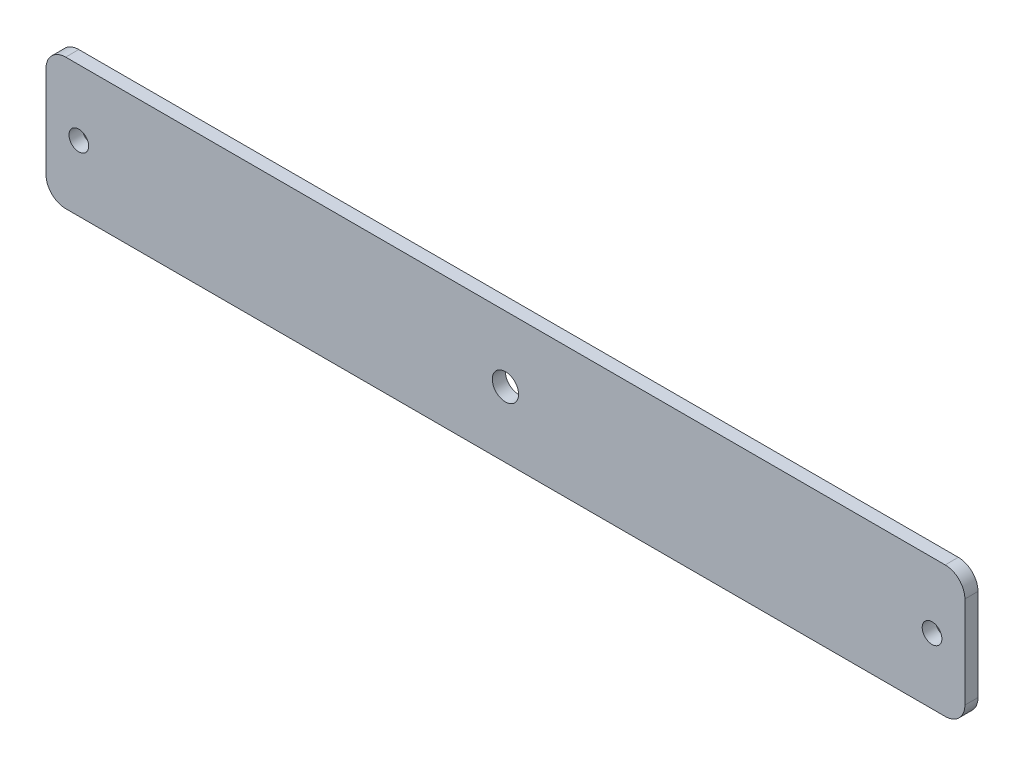
ISO-10303-21;
HEADER;
FILE_DESCRIPTION(('STEP AP214'),'2;1');
FILE_NAME('part.step','',(''),(''),'','','');
FILE_SCHEMA(('AUTOMOTIVE_DESIGN { 1 0 10303 214 1 1 1 1 }'));
ENDSEC;
DATA;
#1=APPLICATION_CONTEXT('core data for automotive mechanical design processes');
#2=APPLICATION_PROTOCOL_DEFINITION('international standard','automotive_design',2000,#1);
#3=PRODUCT_CONTEXT('',#1,'mechanical');
#4=PRODUCT('Part','Part','',(#3));
#5=PRODUCT_RELATED_PRODUCT_CATEGORY('part','',(#4));
#6=PRODUCT_DEFINITION_FORMATION('','',#4);
#7=PRODUCT_DEFINITION_CONTEXT('part definition',#1,'design');
#8=PRODUCT_DEFINITION('design','',#6,#7);
#9=PRODUCT_DEFINITION_SHAPE('','',#8);
#10=(LENGTH_UNIT() NAMED_UNIT(*) SI_UNIT(.MILLI.,.METRE.));
#11=(NAMED_UNIT(*) PLANE_ANGLE_UNIT() SI_UNIT($,.RADIAN.));
#12=(NAMED_UNIT(*) SI_UNIT($,.STERADIAN.) SOLID_ANGLE_UNIT());
#13=UNCERTAINTY_MEASURE_WITH_UNIT(LENGTH_MEASURE(1.E-05),#10,'distance_accuracy_value','');
#14=(GEOMETRIC_REPRESENTATION_CONTEXT(3) GLOBAL_UNCERTAINTY_ASSIGNED_CONTEXT((#13)) GLOBAL_UNIT_ASSIGNED_CONTEXT((#10,
#11,#12)) REPRESENTATION_CONTEXT('',''));
#15=CARTESIAN_POINT('',(0.,0.,0.));
#16=DIRECTION('',(0.,0.,1.));
#17=DIRECTION('',(1.,0.,0.));
#18=AXIS2_PLACEMENT_3D('',#15,#16,#17);
#19=CARTESIAN_POINT('',(0.,0.,2.));
#20=DIRECTION('',(0.,0.,-1.));
#21=DIRECTION('',(-1.,0.,0.));
#22=AXIS2_PLACEMENT_3D('',#19,#20,#21);
#23=PLANE('',#22);
#24=DIRECTION('',(0.,1.,0.));
#25=VECTOR('',#24,1.);
#26=CARTESIAN_POINT('',(73.9464380551708,20.,2.));
#27=LINE('',#26,#25);
#28=CARTESIAN_POINT('',(73.9464380551708,3.,2.));
#29=VERTEX_POINT('',#28);
#30=CARTESIAN_POINT('',(73.9464380551708,17.,2.));
#31=VERTEX_POINT('',#30);
#32=EDGE_CURVE('E204',#29,#31,#27,.T.);
#33=ORIENTED_EDGE('',*,*,#32,.T.);
#34=CARTESIAN_POINT('',(70.9464380551708,17.,2.));
#35=DIRECTION('',(0.,0.,-1.));
#36=DIRECTION('',(-1.,0.,0.));
#37=AXIS2_PLACEMENT_3D('',#34,#35,#36);
#38=CIRCLE('',#37,3.);
#39=CARTESIAN_POINT('',(70.9464380551708,20.,2.));
#40=VERTEX_POINT('',#39);
#41=EDGE_CURVE('E178',#31,#40,#38,.F.);
#42=ORIENTED_EDGE('',*,*,#41,.T.);
#43=DIRECTION('',(-1.,0.,0.));
#44=VECTOR('',#43,1.);
#45=CARTESIAN_POINT('',(-66.0535619448292,20.,2.));
#46=LINE('',#45,#44);
#47=CARTESIAN_POINT('',(-63.0535619448292,20.,2.));
#48=VERTEX_POINT('',#47);
#49=EDGE_CURVE('E131',#40,#48,#46,.T.);
#50=ORIENTED_EDGE('',*,*,#49,.T.);
#51=CARTESIAN_POINT('',(-63.0535619448292,17.,2.));
#52=DIRECTION('',(0.,0.,-1.));
#53=DIRECTION('',(-1.,0.,0.));
#54=AXIS2_PLACEMENT_3D('',#51,#52,#53);
#55=CIRCLE('',#54,3.);
#56=CARTESIAN_POINT('',(-66.0535619448292,17.,2.));
#57=VERTEX_POINT('',#56);
#58=EDGE_CURVE('E66',#48,#57,#55,.F.);
#59=ORIENTED_EDGE('',*,*,#58,.T.);
#60=DIRECTION('',(0.,-1.,0.));
#61=VECTOR('',#60,1.);
#62=CARTESIAN_POINT('',(-66.0535619448292,0.,2.));
#63=LINE('',#62,#61);
#64=CARTESIAN_POINT('',(-66.0535619448292,3.,2.));
#65=VERTEX_POINT('',#64);
#66=EDGE_CURVE('E156',#57,#65,#63,.T.);
#67=ORIENTED_EDGE('',*,*,#66,.T.);
#68=CARTESIAN_POINT('',(-63.0535619448292,3.,2.));
#69=DIRECTION('',(0.,0.,-1.));
#70=DIRECTION('',(-1.,0.,0.));
#71=AXIS2_PLACEMENT_3D('',#68,#69,#70);
#72=CIRCLE('',#71,3.);
#73=CARTESIAN_POINT('',(-63.0535619448292,0.,2.));
#74=VERTEX_POINT('',#73);
#75=EDGE_CURVE('E172',#65,#74,#72,.F.);
#76=ORIENTED_EDGE('',*,*,#75,.T.);
#77=DIRECTION('',(1.,0.,0.));
#78=VECTOR('',#77,1.);
#79=CARTESIAN_POINT('',(73.9464380551708,0.,2.));
#80=LINE('',#79,#78);
#81=CARTESIAN_POINT('',(70.9464380551708,0.,2.));
#82=VERTEX_POINT('',#81);
#83=EDGE_CURVE('E154',#74,#82,#80,.T.);
#84=ORIENTED_EDGE('',*,*,#83,.T.);
#85=CARTESIAN_POINT('',(70.9464380551708,3.,2.));
#86=DIRECTION('',(0.,0.,-1.));
#87=DIRECTION('',(-1.,0.,0.));
#88=AXIS2_PLACEMENT_3D('',#85,#86,#87);
#89=CIRCLE('',#88,3.);
#90=EDGE_CURVE('E175',#82,#29,#89,.F.);
#91=ORIENTED_EDGE('',*,*,#90,.T.);
#92=EDGE_LOOP('',(#33,#42,#50,#59,#67,#76,#84,#91));
#93=FACE_BOUND('',#92,.T.);
#94=CARTESIAN_POINT('',(3.94643805517084,9.99999999999999,2.));
#95=DIRECTION('',(0.,0.,1.));
#96=DIRECTION('',(1.,0.,0.));
#97=AXIS2_PLACEMENT_3D('',#94,#95,#96);
#98=CIRCLE('',#97,2.);
#99=CARTESIAN_POINT('',(5.94643805517084,9.99999999999999,2.));
#100=VERTEX_POINT('',#99);
#101=EDGE_CURVE('E147',#100,#100,#98,.T.);
#102=ORIENTED_EDGE('',*,*,#101,.F.);
#103=EDGE_LOOP('',(#102));
#104=FACE_BOUND('',#103,.T.);
#105=CARTESIAN_POINT('',(-61.0535619448292,9.99999999999999,2.));
#106=DIRECTION('',(0.,0.,1.));
#107=DIRECTION('',(1.,0.,0.));
#108=AXIS2_PLACEMENT_3D('',#105,#106,#107);
#109=CIRCLE('',#108,1.5);
#110=CARTESIAN_POINT('',(-59.5535619448292,9.99999999999999,2.));
#111=VERTEX_POINT('',#110);
#112=EDGE_CURVE('E225',#111,#111,#109,.T.);
#113=ORIENTED_EDGE('',*,*,#112,.F.);
#114=EDGE_LOOP('',(#113));
#115=FACE_BOUND('',#114,.T.);
#116=CARTESIAN_POINT('',(68.9464380551708,9.99999999999999,2.));
#117=DIRECTION('',(0.,0.,1.));
#118=DIRECTION('',(1.,0.,0.));
#119=AXIS2_PLACEMENT_3D('',#116,#117,#118);
#120=CIRCLE('',#119,1.5);
#121=CARTESIAN_POINT('',(70.4464380551708,9.99999999999999,2.));
#122=VERTEX_POINT('',#121);
#123=EDGE_CURVE('E228',#122,#122,#120,.T.);
#124=ORIENTED_EDGE('',*,*,#123,.F.);
#125=EDGE_LOOP('',(#124));
#126=FACE_BOUND('',#125,.T.);
#127=ADVANCED_FACE('F45',(#93,#104,#115,#126),#23,.F.);
#128=CARTESIAN_POINT('',(0.,0.,0.));
#129=DIRECTION('',(0.,0.,-1.));
#130=DIRECTION('',(-1.,0.,0.));
#131=AXIS2_PLACEMENT_3D('',#128,#129,#130);
#132=PLANE('',#131);
#133=CARTESIAN_POINT('',(-61.0535619448292,9.99999999999999,0.));
#134=DIRECTION('',(0.,0.,1.));
#135=DIRECTION('',(1.,0.,0.));
#136=AXIS2_PLACEMENT_3D('',#133,#134,#135);
#137=CIRCLE('',#136,1.5);
#138=CARTESIAN_POINT('',(-59.5535619448292,9.99999999999999,0.));
#139=VERTEX_POINT('',#138);
#140=EDGE_CURVE('E231',#139,#139,#137,.T.);
#141=ORIENTED_EDGE('',*,*,#140,.T.);
#142=EDGE_LOOP('',(#141));
#143=FACE_BOUND('',#142,.T.);
#144=DIRECTION('',(-1.,0.,0.));
#145=VECTOR('',#144,1.);
#146=CARTESIAN_POINT('',(-66.0535619448292,20.,0.));
#147=LINE('',#146,#145);
#148=CARTESIAN_POINT('',(70.9464380551708,20.,0.));
#149=VERTEX_POINT('',#148);
#150=CARTESIAN_POINT('',(-63.0535619448292,20.,0.));
#151=VERTEX_POINT('',#150);
#152=EDGE_CURVE('E129',#149,#151,#147,.T.);
#153=ORIENTED_EDGE('',*,*,#152,.F.);
#154=CARTESIAN_POINT('',(70.9464380551708,17.,0.));
#155=DIRECTION('',(0.,0.,-1.));
#156=DIRECTION('',(-1.,0.,0.));
#157=AXIS2_PLACEMENT_3D('',#154,#155,#156);
#158=CIRCLE('',#157,3.);
#159=CARTESIAN_POINT('',(73.9464380551708,17.,0.));
#160=VERTEX_POINT('',#159);
#161=EDGE_CURVE('E111',#149,#160,#158,.T.);
#162=ORIENTED_EDGE('',*,*,#161,.T.);
#163=DIRECTION('',(0.,1.,0.));
#164=VECTOR('',#163,1.);
#165=CARTESIAN_POINT('',(73.9464380551708,20.,0.));
#166=LINE('',#165,#164);
#167=CARTESIAN_POINT('',(73.9464380551708,3.,0.));
#168=VERTEX_POINT('',#167);
#169=EDGE_CURVE('E141',#168,#160,#166,.T.);
#170=ORIENTED_EDGE('',*,*,#169,.F.);
#171=CARTESIAN_POINT('',(70.9464380551708,3.,0.));
#172=DIRECTION('',(0.,0.,-1.));
#173=DIRECTION('',(-1.,0.,0.));
#174=AXIS2_PLACEMENT_3D('',#171,#172,#173);
#175=CIRCLE('',#174,3.);
#176=CARTESIAN_POINT('',(70.9464380551708,0.,0.));
#177=VERTEX_POINT('',#176);
#178=EDGE_CURVE('E123',#168,#177,#175,.T.);
#179=ORIENTED_EDGE('',*,*,#178,.T.);
#180=DIRECTION('',(1.,0.,0.));
#181=VECTOR('',#180,1.);
#182=CARTESIAN_POINT('',(0.,0.,0.));
#183=LINE('',#182,#181);
#184=CARTESIAN_POINT('',(-63.0535619448292,0.,0.));
#185=VERTEX_POINT('',#184);
#186=EDGE_CURVE('E145',#185,#177,#183,.T.);
#187=ORIENTED_EDGE('',*,*,#186,.F.);
#188=CARTESIAN_POINT('',(-63.0535619448292,3.,0.));
#189=DIRECTION('',(0.,0.,-1.));
#190=DIRECTION('',(-1.,0.,0.));
#191=AXIS2_PLACEMENT_3D('',#188,#189,#190);
#192=CIRCLE('',#191,3.);
#193=CARTESIAN_POINT('',(-66.0535619448292,3.,0.));
#194=VERTEX_POINT('',#193);
#195=EDGE_CURVE('E160',#185,#194,#192,.T.);
#196=ORIENTED_EDGE('',*,*,#195,.T.);
#197=DIRECTION('',(0.,-1.,0.));
#198=VECTOR('',#197,1.);
#199=CARTESIAN_POINT('',(-66.0535619448292,0.,0.));
#200=LINE('',#199,#198);
#201=CARTESIAN_POINT('',(-66.0535619448292,17.,0.));
#202=VERTEX_POINT('',#201);
#203=EDGE_CURVE('E140',#202,#194,#200,.T.);
#204=ORIENTED_EDGE('',*,*,#203,.F.);
#205=CARTESIAN_POINT('',(-63.0535619448292,17.,0.));
#206=DIRECTION('',(0.,0.,-1.));
#207=DIRECTION('',(-1.,0.,0.));
#208=AXIS2_PLACEMENT_3D('',#205,#206,#207);
#209=CIRCLE('',#208,3.);
#210=EDGE_CURVE('E133',#202,#151,#209,.T.);
#211=ORIENTED_EDGE('',*,*,#210,.T.);
#212=EDGE_LOOP('',(#153,#162,#170,#179,#187,#196,#204,#211));
#213=FACE_BOUND('',#212,.T.);
#214=CARTESIAN_POINT('',(3.94643805517084,9.99999999999999,0.));
#215=DIRECTION('',(0.,0.,1.));
#216=DIRECTION('',(1.,0.,0.));
#217=AXIS2_PLACEMENT_3D('',#214,#215,#216);
#218=CIRCLE('',#217,2.);
#219=CARTESIAN_POINT('',(5.94643805517084,9.99999999999999,0.));
#220=VERTEX_POINT('',#219);
#221=EDGE_CURVE('E210',#220,#220,#218,.T.);
#222=ORIENTED_EDGE('',*,*,#221,.T.);
#223=EDGE_LOOP('',(#222));
#224=FACE_BOUND('',#223,.T.);
#225=CARTESIAN_POINT('',(68.9464380551708,9.99999999999999,0.));
#226=DIRECTION('',(0.,0.,1.));
#227=DIRECTION('',(1.,0.,0.));
#228=AXIS2_PLACEMENT_3D('',#225,#226,#227);
#229=CIRCLE('',#228,1.5);
#230=CARTESIAN_POINT('',(70.4464380551708,9.99999999999999,0.));
#231=VERTEX_POINT('',#230);
#232=EDGE_CURVE('E232',#231,#231,#229,.T.);
#233=ORIENTED_EDGE('',*,*,#232,.T.);
#234=EDGE_LOOP('',(#233));
#235=FACE_BOUND('',#234,.T.);
#236=ADVANCED_FACE('F136',(#143,#213,#224,#235),#132,.T.);
#237=CARTESIAN_POINT('',(73.9464380551708,20.,2.));
#238=DIRECTION('',(-1.,0.,0.));
#239=DIRECTION('',(0.,0.,1.));
#240=AXIS2_PLACEMENT_3D('',#237,#238,#239);
#241=PLANE('',#240);
#242=ORIENTED_EDGE('',*,*,#169,.T.);
#243=DIRECTION('',(0.,0.,-1.));
#244=VECTOR('',#243,1.);
#245=CARTESIAN_POINT('',(73.9464380551708,17.,2.));
#246=LINE('',#245,#244);
#247=EDGE_CURVE('E116',#160,#31,#246,.F.);
#248=ORIENTED_EDGE('',*,*,#247,.T.);
#249=ORIENTED_EDGE('',*,*,#32,.F.);
#250=DIRECTION('',(0.,0.,-1.));
#251=VECTOR('',#250,1.);
#252=CARTESIAN_POINT('',(73.9464380551708,3.,2.));
#253=LINE('',#252,#251);
#254=EDGE_CURVE('E122',#29,#168,#253,.T.);
#255=ORIENTED_EDGE('',*,*,#254,.T.);
#256=EDGE_LOOP('',(#242,#248,#249,#255));
#257=FACE_BOUND('',#256,.T.);
#258=ADVANCED_FACE('F264',(#257),#241,.F.);
#259=CARTESIAN_POINT('',(-66.0535619448292,20.,2.));
#260=DIRECTION('',(0.,-1.,0.));
#261=DIRECTION('',(0.,0.,-1.));
#262=AXIS2_PLACEMENT_3D('',#259,#260,#261);
#263=PLANE('',#262);
#264=ORIENTED_EDGE('',*,*,#49,.F.);
#265=DIRECTION('',(0.,0.,-1.));
#266=VECTOR('',#265,1.);
#267=CARTESIAN_POINT('',(70.9464380551708,20.,2.));
#268=LINE('',#267,#266);
#269=EDGE_CURVE('E115',#40,#149,#268,.T.);
#270=ORIENTED_EDGE('',*,*,#269,.T.);
#271=ORIENTED_EDGE('',*,*,#152,.T.);
#272=DIRECTION('',(0.,0.,-1.));
#273=VECTOR('',#272,1.);
#274=CARTESIAN_POINT('',(-63.0535619448292,20.,2.));
#275=LINE('',#274,#273);
#276=EDGE_CURVE('E134',#151,#48,#275,.F.);
#277=ORIENTED_EDGE('',*,*,#276,.T.);
#278=EDGE_LOOP('',(#264,#270,#271,#277));
#279=FACE_BOUND('',#278,.T.);
#280=ADVANCED_FACE('F128',(#279),#263,.F.);
#281=CARTESIAN_POINT('',(-66.0535619448292,0.,2.));
#282=DIRECTION('',(1.,0.,0.));
#283=DIRECTION('',(0.,0.,-1.));
#284=AXIS2_PLACEMENT_3D('',#281,#282,#283);
#285=PLANE('',#284);
#286=ORIENTED_EDGE('',*,*,#203,.T.);
#287=DIRECTION('',(0.,0.,-1.));
#288=VECTOR('',#287,1.);
#289=CARTESIAN_POINT('',(-66.0535619448292,3.,2.));
#290=LINE('',#289,#288);
#291=EDGE_CURVE('E11',#194,#65,#290,.F.);
#292=ORIENTED_EDGE('',*,*,#291,.T.);
#293=ORIENTED_EDGE('',*,*,#66,.F.);
#294=DIRECTION('',(0.,0.,-1.));
#295=VECTOR('',#294,1.);
#296=CARTESIAN_POINT('',(-66.0535619448292,17.,2.));
#297=LINE('',#296,#295);
#298=EDGE_CURVE('E54',#57,#202,#297,.T.);
#299=ORIENTED_EDGE('',*,*,#298,.T.);
#300=EDGE_LOOP('',(#286,#292,#293,#299));
#301=FACE_BOUND('',#300,.T.);
#302=ADVANCED_FACE('F190',(#301),#285,.F.);
#303=CARTESIAN_POINT('',(0.,0.,2.));
#304=DIRECTION('',(0.,1.,0.));
#305=DIRECTION('',(0.,0.,1.));
#306=AXIS2_PLACEMENT_3D('',#303,#304,#305);
#307=PLANE('',#306);
#308=ORIENTED_EDGE('',*,*,#186,.T.);
#309=DIRECTION('',(0.,0.,-1.));
#310=VECTOR('',#309,1.);
#311=CARTESIAN_POINT('',(70.9464380551708,0.,2.));
#312=LINE('',#311,#310);
#313=EDGE_CURVE('E185',#177,#82,#312,.F.);
#314=ORIENTED_EDGE('',*,*,#313,.T.);
#315=ORIENTED_EDGE('',*,*,#83,.F.);
#316=DIRECTION('',(0.,0.,-1.));
#317=VECTOR('',#316,1.);
#318=CARTESIAN_POINT('',(-63.0535619448292,0.,2.));
#319=LINE('',#318,#317);
#320=EDGE_CURVE('E181',#74,#185,#319,.T.);
#321=ORIENTED_EDGE('',*,*,#320,.T.);
#322=EDGE_LOOP('',(#308,#314,#315,#321));
#323=FACE_BOUND('',#322,.T.);
#324=ADVANCED_FACE('F199',(#323),#307,.F.);
#325=CARTESIAN_POINT('',(3.94643805517084,9.99999999999999,2.));
#326=DIRECTION('',(0.,0.,-1.));
#327=DIRECTION('',(-1.,0.,0.));
#328=AXIS2_PLACEMENT_3D('',#325,#326,#327);
#329=CYLINDRICAL_SURFACE('',#328,2.);
#330=ORIENTED_EDGE('',*,*,#101,.T.);
#331=EDGE_LOOP('',(#330));
#332=FACE_BOUND('',#331,.T.);
#333=ORIENTED_EDGE('',*,*,#221,.F.);
#334=EDGE_LOOP('',(#333));
#335=FACE_BOUND('',#334,.T.);
#336=ADVANCED_FACE('F249',(#332,#335),#329,.F.);
#337=CARTESIAN_POINT('',(-61.0535619448292,9.99999999999999,2.));
#338=DIRECTION('',(0.,0.,-1.));
#339=DIRECTION('',(-1.,0.,0.));
#340=AXIS2_PLACEMENT_3D('',#337,#338,#339);
#341=CYLINDRICAL_SURFACE('',#340,1.5);
#342=ORIENTED_EDGE('',*,*,#112,.T.);
#343=EDGE_LOOP('',(#342));
#344=FACE_BOUND('',#343,.T.);
#345=ORIENTED_EDGE('',*,*,#140,.F.);
#346=EDGE_LOOP('',(#345));
#347=FACE_BOUND('',#346,.T.);
#348=ADVANCED_FACE('F251',(#344,#347),#341,.F.);
#349=CARTESIAN_POINT('',(68.9464380551708,9.99999999999999,2.));
#350=DIRECTION('',(0.,0.,-1.));
#351=DIRECTION('',(-1.,0.,0.));
#352=AXIS2_PLACEMENT_3D('',#349,#350,#351);
#353=CYLINDRICAL_SURFACE('',#352,1.5);
#354=ORIENTED_EDGE('',*,*,#123,.T.);
#355=EDGE_LOOP('',(#354));
#356=FACE_BOUND('',#355,.T.);
#357=ORIENTED_EDGE('',*,*,#232,.F.);
#358=EDGE_LOOP('',(#357));
#359=FACE_BOUND('',#358,.T.);
#360=ADVANCED_FACE('F256',(#356,#359),#353,.F.);
#361=CARTESIAN_POINT('',(70.9464380551708,17.,2.));
#362=DIRECTION('',(0.,0.,-1.));
#363=DIRECTION('',(-1.,0.,0.));
#364=AXIS2_PLACEMENT_3D('',#361,#362,#363);
#365=CYLINDRICAL_SURFACE('',#364,3.);
#366=ORIENTED_EDGE('',*,*,#41,.F.);
#367=ORIENTED_EDGE('',*,*,#247,.F.);
#368=ORIENTED_EDGE('',*,*,#161,.F.);
#369=ORIENTED_EDGE('',*,*,#269,.F.);
#370=EDGE_LOOP('',(#366,#367,#368,#369));
#371=FACE_BOUND('',#370,.T.);
#372=ADVANCED_FACE('F114',(#371),#365,.T.);
#373=CARTESIAN_POINT('',(70.9464380551708,3.,2.));
#374=DIRECTION('',(0.,0.,-1.));
#375=DIRECTION('',(-1.,0.,0.));
#376=AXIS2_PLACEMENT_3D('',#373,#374,#375);
#377=CYLINDRICAL_SURFACE('',#376,3.);
#378=ORIENTED_EDGE('',*,*,#90,.F.);
#379=ORIENTED_EDGE('',*,*,#313,.F.);
#380=ORIENTED_EDGE('',*,*,#178,.F.);
#381=ORIENTED_EDGE('',*,*,#254,.F.);
#382=EDGE_LOOP('',(#378,#379,#380,#381));
#383=FACE_BOUND('',#382,.T.);
#384=ADVANCED_FACE('F276',(#383),#377,.T.);
#385=CARTESIAN_POINT('',(-63.0535619448292,3.,2.));
#386=DIRECTION('',(0.,0.,-1.));
#387=DIRECTION('',(-1.,0.,0.));
#388=AXIS2_PLACEMENT_3D('',#385,#386,#387);
#389=CYLINDRICAL_SURFACE('',#388,3.);
#390=ORIENTED_EDGE('',*,*,#75,.F.);
#391=ORIENTED_EDGE('',*,*,#291,.F.);
#392=ORIENTED_EDGE('',*,*,#195,.F.);
#393=ORIENTED_EDGE('',*,*,#320,.F.);
#394=EDGE_LOOP('',(#390,#391,#392,#393));
#395=FACE_BOUND('',#394,.T.);
#396=ADVANCED_FACE('F196',(#395),#389,.T.);
#397=CARTESIAN_POINT('',(-63.0535619448292,17.,2.));
#398=DIRECTION('',(0.,0.,-1.));
#399=DIRECTION('',(-1.,0.,0.));
#400=AXIS2_PLACEMENT_3D('',#397,#398,#399);
#401=CYLINDRICAL_SURFACE('',#400,3.);
#402=ORIENTED_EDGE('',*,*,#58,.F.);
#403=ORIENTED_EDGE('',*,*,#276,.F.);
#404=ORIENTED_EDGE('',*,*,#210,.F.);
#405=ORIENTED_EDGE('',*,*,#298,.F.);
#406=EDGE_LOOP('',(#402,#403,#404,#405));
#407=FACE_BOUND('',#406,.T.);
#408=ADVANCED_FACE('F47',(#407),#401,.T.);
#409=CLOSED_SHELL('',(#127,#236,#258,#280,#302,#324,#336,#348,#360,#372,#384,#396,#408));
#410=MANIFOLD_SOLID_BREP('B2',#409);
#411=ADVANCED_BREP_SHAPE_REPRESENTATION('',(#18,#410),#14);
#412=SHAPE_DEFINITION_REPRESENTATION(#9,#411);
ENDSEC;
END-ISO-10303-21;
